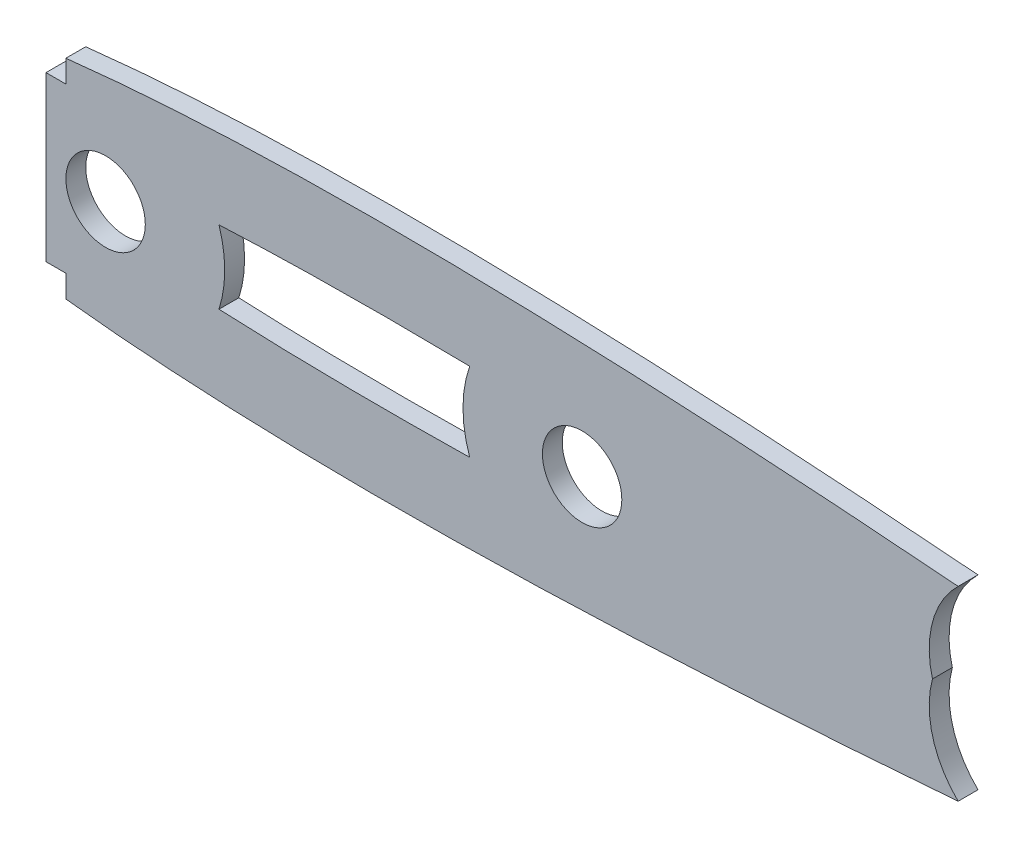
ISO-10303-21;
HEADER;
FILE_DESCRIPTION(('STEP AP214'),'2;1');
FILE_NAME('part.step','',(''),(''),'','','');
FILE_SCHEMA(('AUTOMOTIVE_DESIGN { 1 0 10303 214 1 1 1 1 }'));
ENDSEC;
DATA;
#1=APPLICATION_CONTEXT('core data for automotive mechanical design processes');
#2=APPLICATION_PROTOCOL_DEFINITION('international standard','automotive_design',2000,#1);
#3=PRODUCT_CONTEXT('',#1,'mechanical');
#4=PRODUCT('Part','Part','',(#3));
#5=PRODUCT_RELATED_PRODUCT_CATEGORY('part','',(#4));
#6=PRODUCT_DEFINITION_FORMATION('','',#4);
#7=PRODUCT_DEFINITION_CONTEXT('part definition',#1,'design');
#8=PRODUCT_DEFINITION('design','',#6,#7);
#9=PRODUCT_DEFINITION_SHAPE('','',#8);
#10=(LENGTH_UNIT() NAMED_UNIT(*) SI_UNIT(.MILLI.,.METRE.));
#11=(NAMED_UNIT(*) PLANE_ANGLE_UNIT() SI_UNIT($,.RADIAN.));
#12=(NAMED_UNIT(*) SI_UNIT($,.STERADIAN.) SOLID_ANGLE_UNIT());
#13=UNCERTAINTY_MEASURE_WITH_UNIT(LENGTH_MEASURE(1.E-05),#10,'distance_accuracy_value','');
#14=(GEOMETRIC_REPRESENTATION_CONTEXT(3) GLOBAL_UNCERTAINTY_ASSIGNED_CONTEXT((#13)) GLOBAL_UNIT_ASSIGNED_CONTEXT((#10,
#11,#12)) REPRESENTATION_CONTEXT('',''));
#15=CARTESIAN_POINT('',(0.,0.,0.));
#16=DIRECTION('',(0.,0.,1.));
#17=DIRECTION('',(1.,0.,0.));
#18=AXIS2_PLACEMENT_3D('',#15,#16,#17);
#19=CARTESIAN_POINT('',(0.0170900845920282,-0.403411610866982,3.175));
#20=DIRECTION('',(0.,0.,-1.));
#21=DIRECTION('',(-1.,0.,0.));
#22=AXIS2_PLACEMENT_3D('',#19,#20,#21);
#23=PLANE('',#22);
#24=CARTESIAN_POINT('',(50.8,0.,3.175));
#25=DIRECTION('',(0.,0.,1.));
#26=DIRECTION('',(1.,0.,0.));
#27=AXIS2_PLACEMENT_3D('',#24,#25,#26);
#28=CIRCLE('',#27,6.35);
#29=CARTESIAN_POINT('',(57.15,0.,3.175));
#30=VERTEX_POINT('',#29);
#31=EDGE_CURVE('E312',#30,#30,#28,.T.);
#32=ORIENTED_EDGE('',*,*,#31,.F.);
#33=EDGE_LOOP('',(#32));
#34=FACE_BOUND('',#33,.T.);
#35=CARTESIAN_POINT('',(127.,0.,3.175));
#36=DIRECTION('',(0.,0.,1.));
#37=DIRECTION('',(1.,0.,0.));
#38=AXIS2_PLACEMENT_3D('',#35,#36,#37);
#39=CIRCLE('',#38,6.35);
#40=CARTESIAN_POINT('',(133.35,0.,3.175));
#41=VERTEX_POINT('',#40);
#42=EDGE_CURVE('E300',#41,#41,#39,.T.);
#43=ORIENTED_EDGE('',*,*,#42,.F.);
#44=EDGE_LOOP('',(#43));
#45=FACE_BOUND('',#44,.T.);
#46=CARTESIAN_POINT('',(318.77,0.4016502,3.175));
#47=CARTESIAN_POINT('',(318.651672050798,0.50081062510207,3.175));
#48=CARTESIAN_POINT('',(317.88713952083,0.407183951533016,3.175));
#49=CARTESIAN_POINT('',(316.525702267064,0.7904298347905,3.175));
#50=CARTESIAN_POINT('',(314.029007456015,1.02731081399014,3.175));
#51=CARTESIAN_POINT('',(310.665580367581,1.53568645613262,3.175));
#52=CARTESIAN_POINT('',(306.332982445315,2.1029997142592,3.175));
#53=CARTESIAN_POINT('',(301.108142880642,2.80218722429085,3.175));
#54=CARTESIAN_POINT('',(295.004655139781,3.59255228155884,3.175));
#55=CARTESIAN_POINT('',(288.066717305627,4.47252129999186,3.175));
#56=CARTESIAN_POINT('',(280.334877507848,5.42667867616247,3.175));
#57=CARTESIAN_POINT('',(271.857503413929,6.44211126091389,3.175));
#58=CARTESIAN_POINT('',(262.68670258513,7.50622472654808,3.175));
#59=CARTESIAN_POINT('',(252.878949160097,8.60453143464443,3.175));
#60=CARTESIAN_POINT('',(242.494745531819,9.72362194936592,3.175));
#61=CARTESIAN_POINT('',(231.598187206488,10.8495970231666,3.175));
#62=CARTESIAN_POINT('',(220.256428580463,11.9679230852741,3.175));
#63=CARTESIAN_POINT('',(208.539426289446,13.0629021970691,3.175));
#64=CARTESIAN_POINT('',(196.519338709918,14.1201595424354,3.175));
#65=CARTESIAN_POINT('',(184.270405083069,15.1220196708537,3.175));
#66=CARTESIAN_POINT('',(171.867889748649,16.0521472129467,3.175));
#67=CARTESIAN_POINT('',(159.388371015463,16.8932736087619,3.175));
#68=CARTESIAN_POINT('',(146.908740176365,17.6278116310836,3.175));
#69=CARTESIAN_POINT('',(134.505824676557,18.23720410278,3.175));
#70=CARTESIAN_POINT('',(122.256224526093,18.705201006698,3.175));
#71=CARTESIAN_POINT('',(110.23510919994,19.0165345268771,3.175));
#72=CARTESIAN_POINT('',(98.5167667377854,19.1559979551147,3.175));
#73=CARTESIAN_POINT('',(87.1732015056204,19.1125234147679,3.175));
#74=CARTESIAN_POINT('',(76.2743495407503,18.8777134468916,3.175));
#75=CARTESIAN_POINT('',(65.8872982521429,18.4456158754961,3.175));
#76=CARTESIAN_POINT('',(56.0759819312477,17.8151004006929,3.175));
#77=CARTESIAN_POINT('',(46.9007012854392,16.9880642018893,3.175));
#78=CARTESIAN_POINT('',(38.4176025007467,15.9709664672286,3.175));
#79=CARTESIAN_POINT('',(30.6783927826995,14.7724611931374,3.175));
#80=CARTESIAN_POINT('',(23.7299698701266,13.4050657428601,3.175));
#81=CARTESIAN_POINT('',(17.6130594258367,11.8842416218078,3.175));
#82=CARTESIAN_POINT('',(12.3624203887116,10.2248187616682,3.175));
#83=CARTESIAN_POINT('',(8.00472945000562,8.44225238170004,3.175));
#84=CARTESIAN_POINT('',(4.55388340735938,6.54860238146803,3.175));
#85=CARTESIAN_POINT('',(2.01519229032135,4.54013127991722,3.175));
#86=CARTESIAN_POINT('',(0.389181284538515,2.36824959719999,3.175));
#87=CARTESIAN_POINT('',(-0.181372315669338,0.,3.175));
#88=CARTESIAN_POINT('',(0.389181284538492,-2.36824959719995,3.175));
#89=CARTESIAN_POINT('',(2.01519229032142,-4.5401312799173,3.175));
#90=CARTESIAN_POINT('',(4.55388340735933,-6.54860238146799,3.175));
#91=CARTESIAN_POINT('',(8.00472945000561,-8.44225238170004,3.175));
#92=CARTESIAN_POINT('',(12.3624203887116,-10.2248187616682,3.175));
#93=CARTESIAN_POINT('',(17.6130594258367,-11.8842416218078,3.175));
#94=CARTESIAN_POINT('',(23.7299698701266,-13.4050657428601,3.175));
#95=CARTESIAN_POINT('',(30.6783927826996,-14.7724611931374,3.175));
#96=CARTESIAN_POINT('',(38.4176025007467,-15.9709664672285,3.175));
#97=CARTESIAN_POINT('',(46.9007012854392,-16.9880642018893,3.175));
#98=CARTESIAN_POINT('',(56.0759819312477,-17.8151004006929,3.175));
#99=CARTESIAN_POINT('',(65.8872982521429,-18.4456158754961,3.175));
#100=CARTESIAN_POINT('',(76.2743495407503,-18.8777134468916,3.175));
#101=CARTESIAN_POINT('',(87.1732015056205,-19.1125234147679,3.175));
#102=CARTESIAN_POINT('',(98.5167667377854,-19.1559979551147,3.175));
#103=CARTESIAN_POINT('',(110.23510919994,-19.0165345268771,3.175));
#104=CARTESIAN_POINT('',(122.256224526093,-18.705201006698,3.175));
#105=CARTESIAN_POINT('',(134.505824676556,-18.23720410278,3.175));
#106=CARTESIAN_POINT('',(146.908740176365,-17.6278116310836,3.175));
#107=CARTESIAN_POINT('',(159.388371015463,-16.8932736087619,3.175));
#108=CARTESIAN_POINT('',(171.867889748649,-16.0521472129467,3.175));
#109=CARTESIAN_POINT('',(184.270405083069,-15.1220196708537,3.175));
#110=CARTESIAN_POINT('',(196.519338709918,-14.1201595424354,3.175));
#111=CARTESIAN_POINT('',(208.539426289446,-13.0629021970691,3.175));
#112=CARTESIAN_POINT('',(220.256428580463,-11.9679230852741,3.175));
#113=CARTESIAN_POINT('',(231.598187206488,-10.8495970231665,3.175));
#114=CARTESIAN_POINT('',(242.494745531819,-9.72362194936593,3.175));
#115=CARTESIAN_POINT('',(252.878949160097,-8.60453143464443,3.175));
#116=CARTESIAN_POINT('',(262.68670258513,-7.50622472654809,3.175));
#117=CARTESIAN_POINT('',(271.857503413929,-6.44211126091389,3.175));
#118=CARTESIAN_POINT('',(280.334877507848,-5.42667867616247,3.175));
#119=CARTESIAN_POINT('',(288.066717305627,-4.47252129999186,3.175));
#120=CARTESIAN_POINT('',(295.004655139781,-3.59255228155884,3.175));
#121=CARTESIAN_POINT('',(301.108142880642,-2.80218722429085,3.175));
#122=CARTESIAN_POINT('',(306.332982445315,-2.10299971425921,3.175));
#123=CARTESIAN_POINT('',(310.66558036758,-1.53568645613261,3.175));
#124=CARTESIAN_POINT('',(314.029007456015,-1.02731081399015,3.175));
#125=CARTESIAN_POINT('',(316.525702267064,-0.790429834790499,3.175));
#126=CARTESIAN_POINT('',(317.88713952083,-0.407183951532999,3.175));
#127=CARTESIAN_POINT('',(318.961628570184,-0.538768719393173,3.175));
#128=CARTESIAN_POINT('',(318.961628570184,0.241062861088163,3.175));
#129=CARTESIAN_POINT('',(318.77,0.4016502,3.175));
#130=B_SPLINE_CURVE_WITH_KNOTS('',3,(#46,#47,#48,#49,#50,#51,#52,#53,#54,#55,#56,#57,#58,#59,
#60,#61,#62,#63,#64,#65,#66,#67,#68,#69,#70,#71,#72,#73,#74,#75,#76,#77,#78,#79,#80,#81,#82,#83,
#84,#85,#86,#87,#88,#89,#90,#91,#92,#93,#94,#95,#96,#97,#98,#99,#100,#101,#102,#103,#104,#105,
#106,#107,#108,#109,#110,#111,#112,#113,#114,#115,#116,#117,#118,#119,#120,#121,#122,#123,#124,
#125,#126,#127,#128,#129),.UNSPECIFIED.,.T.,.F.,(4,1,1,1,1,1,1,1,1,1,1,1,1,1,1,1,1,1,1,1,1,1,1,
1,1,1,1,1,1,1,1,1,1,1,1,1,1,1,1,1,1,1,1,1,1,1,1,1,1,1,1,1,1,1,1,1,1,1,1,1,1,1,1,1,1,1,1,1,1,1,1,
1,1,1,1,1,1,1,1,1,1,4),(0.,0.00076221465102857,0.00304470631082172,0.00683224554312919,
0.0121011758037585,0.0188175356586858,0.026939454793122,0.0364148482585568,0.0471846285955964,
0.0591804130998147,0.0723278736139124,0.0865440610891483,0.101740580336553,0.117823336433574,
0.134691452208322,0.152240154447155,0.170361289964637,0.188941007849542,0.207865435445639,
0.227016078022501,0.246275695980001,0.265524943249896,0.284644966110444,0.303520118268662,
0.322034575374331,0.340078352914118,0.357542593241702,0.374325481920834,0.390329890871888,
0.405463889739095,0.419643801445685,0.43279337139134,0.444843816743186,0.455737920704734,
0.465428653233085,0.473886320085416,0.481101634077569,0.487101684418678,0.491975368345093,
0.495930677807379,0.499382808099288,0.502834938391198,0.506790247853484,0.511663931779899,
0.517663982121008,0.524879296113161,0.533336962965492,0.543027695493843,0.553921799455391,
0.565972244807237,0.579121814752892,0.593301726459482,0.608435725326689,0.624440134277742,
0.641223022956875,0.658687263284459,0.676731040824246,0.695245497929915,0.714120650088133,
0.733240672948681,0.752489920218576,0.771749538176075,0.790900180752937,0.809824608349034,
0.82840432623394,0.846525461751422,0.864074163990254,0.880942279765002,0.897025035862024,
0.912221555109428,0.926437742584664,0.939585203098762,0.95158098760298,0.96235076794002,
0.971826161405454,0.97994808053989,0.986664440394818,0.991933370655447,0.995720909887755,
0.998003401547548,0.998765616198576,1.),.UNSPECIFIED.);
#131=CARTESIAN_POINT('',(44.4468769341881,-16.6766275435191,3.175));
#132=VERTEX_POINT('',#131);
#133=CARTESIAN_POINT('',(187.131379050379,-14.8815283728172,3.175));
#134=VERTEX_POINT('',#133);
#135=EDGE_CURVE('E53',#132,#134,#130,.T.);
#136=ORIENTED_EDGE('',*,*,#135,.T.);
#137=CARTESIAN_POINT('',(197.744431020284,-3.94440224736243,3.175));
#138=DIRECTION('',(0.,0.,1.));
#139=DIRECTION('',(1.,0.,0.));
#140=AXIS2_PLACEMENT_3D('',#137,#138,#139);
#141=CIRCLE('',#140,15.24);
#142=CARTESIAN_POINT('',(183.023721427638,0.,3.175));
#143=VERTEX_POINT('',#142);
#144=EDGE_CURVE('E394',#143,#134,#141,.T.);
#145=ORIENTED_EDGE('',*,*,#144,.F.);
#146=CARTESIAN_POINT('',(197.744431020284,3.94440224736244,3.175));
#147=DIRECTION('',(0.,0.,1.));
#148=DIRECTION('',(1.,0.,0.));
#149=AXIS2_PLACEMENT_3D('',#146,#147,#148);
#150=CIRCLE('',#149,15.24);
#151=CARTESIAN_POINT('',(187.131379050379,14.8815283728172,3.175));
#152=VERTEX_POINT('',#151);
#153=EDGE_CURVE('E391',#152,#143,#150,.T.);
#154=ORIENTED_EDGE('',*,*,#153,.F.);
#155=CARTESIAN_POINT('',(44.4468769341882,16.6766275435191,3.175));
#156=VERTEX_POINT('',#155);
#157=EDGE_CURVE('E289',#152,#156,#130,.T.);
#158=ORIENTED_EDGE('',*,*,#157,.T.);
#159=DIRECTION('',(0.,1.,0.));
#160=VECTOR('',#159,1.);
#161=CARTESIAN_POINT('',(44.4468769341882,16.6766275435191,3.175));
#162=LINE('',#161,#160);
#163=CARTESIAN_POINT('',(44.4468769341882,13.0978024018442,3.175));
#164=VERTEX_POINT('',#163);
#165=EDGE_CURVE('E339',#164,#156,#162,.T.);
#166=ORIENTED_EDGE('',*,*,#165,.F.);
#167=DIRECTION('',(1.,0.,0.));
#168=VECTOR('',#167,1.);
#169=CARTESIAN_POINT('',(41.2718769341882,13.0978024018442,3.175));
#170=LINE('',#169,#168);
#171=CARTESIAN_POINT('',(41.2718769341882,13.0978024018442,3.175));
#172=VERTEX_POINT('',#171);
#173=EDGE_CURVE('E344',#172,#164,#170,.T.);
#174=ORIENTED_EDGE('',*,*,#173,.F.);
#175=DIRECTION('',(0.,1.,0.));
#176=VECTOR('',#175,1.);
#177=CARTESIAN_POINT('',(41.2718769341882,13.0978024018442,3.175));
#178=LINE('',#177,#176);
#179=CARTESIAN_POINT('',(41.2718769341882,-13.0978024018442,3.175));
#180=VERTEX_POINT('',#179);
#181=EDGE_CURVE('E348',#180,#172,#178,.T.);
#182=ORIENTED_EDGE('',*,*,#181,.F.);
#183=DIRECTION('',(-1.,0.,0.));
#184=VECTOR('',#183,1.);
#185=CARTESIAN_POINT('',(41.2718769341882,-13.0978024018442,3.175));
#186=LINE('',#185,#184);
#187=CARTESIAN_POINT('',(44.4468769341881,-13.0978024018442,3.175));
#188=VERTEX_POINT('',#187);
#189=EDGE_CURVE('E352',#188,#180,#186,.T.);
#190=ORIENTED_EDGE('',*,*,#189,.F.);
#191=DIRECTION('',(0.,1.,0.));
#192=VECTOR('',#191,1.);
#193=CARTESIAN_POINT('',(44.4468769341881,-13.0978024018442,3.175));
#194=LINE('',#193,#192);
#195=EDGE_CURVE('E356',#132,#188,#194,.T.);
#196=ORIENTED_EDGE('',*,*,#195,.F.);
#197=EDGE_LOOP('',(#136,#145,#154,#158,#166,#174,#182,#190,#196));
#198=FACE_BOUND('',#197,.T.);
#199=CARTESIAN_POINT('',(50.8,0.,3.175));
#200=DIRECTION('',(0.,0.,-1.));
#201=DIRECTION('',(1.,0.,0.));
#202=AXIS2_PLACEMENT_3D('',#199,#200,#201);
#203=CIRCLE('',#202,19.05);
#204=CARTESIAN_POINT('',(68.9313822041634,5.84426893345514,3.175));
#205=VERTEX_POINT('',#204);
#206=CARTESIAN_POINT('',(68.9313822041634,-5.84426893345512,3.175));
#207=VERTEX_POINT('',#206);
#208=EDGE_CURVE('E201',#205,#207,#203,.T.);
#209=ORIENTED_EDGE('',*,*,#208,.F.);
#210=CARTESIAN_POINT('',(109.024999433795,6.30887110696607,3.175));
#211=CARTESIAN_POINT('',(108.558469644795,6.31714861166145,3.175));
#212=CARTESIAN_POINT('',(108.091996748882,6.32503468756925,3.175));
#213=CARTESIAN_POINT('',(102.418728939465,6.41612991672182,3.175));
#214=CARTESIAN_POINT('',(97.2187146448106,6.44976027812399,3.175));
#215=CARTESIAN_POINT('',(86.8410911890206,6.39516748695382,3.175));
#216=CARTESIAN_POINT('',(81.6632984825462,6.30714769250087,3.175));
#217=CARTESIAN_POINT('',(73.9743318119232,6.06247541528278,3.175));
#218=CARTESIAN_POINT('',(71.4498997072654,5.96378970195194,3.175));
#219=CARTESIAN_POINT('',(68.9313822041634,5.84426893345513,3.175));
#220=B_SPLINE_CURVE_WITH_KNOTS('',3,(#210,#211,#212,#213,#214,#215,#216,#217,#218,#219),
.UNSPECIFIED.,.F.,.F.,(4,2,2,2,4),(0.488802875488267,0.5,0.625,0.75,0.811254784558479),.UNSPECIFIED.);
#221=CARTESIAN_POINT('',(109.024999433795,6.30887110696607,3.175));
#222=VERTEX_POINT('',#221);
#223=EDGE_CURVE('E61',#222,#205,#220,.T.);
#224=ORIENTED_EDGE('',*,*,#223,.F.);
#225=CARTESIAN_POINT('',(127.000000000224,5.89378404812814E-10,3.175));
#226=DIRECTION('',(0.,0.,-1.));
#227=DIRECTION('',(1.,0.,0.));
#228=AXIS2_PLACEMENT_3D('',#225,#226,#227);
#229=CIRCLE('',#228,19.05);
#230=CARTESIAN_POINT('',(109.024999434215,-6.30887110698605,3.175));
#231=VERTEX_POINT('',#230);
#232=EDGE_CURVE('E164',#231,#222,#229,.T.);
#233=ORIENTED_EDGE('',*,*,#232,.F.);
#234=CARTESIAN_POINT('',(68.9313822041634,-5.84426893345512,3.175));
#235=CARTESIAN_POINT('',(71.4498997074031,-5.96378970196082,3.175));
#236=CARTESIAN_POINT('',(73.9743318121993,-6.06247541529812,3.175));
#237=CARTESIAN_POINT('',(81.6632984829615,-6.30714769252073,3.175));
#238=CARTESIAN_POINT('',(86.8410911894363,-6.39516748697372,3.175));
#239=CARTESIAN_POINT('',(97.2187146452269,-6.44976027814397,3.175));
#240=CARTESIAN_POINT('',(102.418728939882,-6.41612991674183,3.175));
#241=CARTESIAN_POINT('',(108.0919967493,-6.32503468758927,3.175));
#242=CARTESIAN_POINT('',(108.558469645214,-6.31714861168146,3.175));
#243=CARTESIAN_POINT('',(109.024999434215,-6.30887110698605,3.175));
#244=B_SPLINE_CURVE_WITH_KNOTS('',3,(#234,#235,#236,#237,#238,#239,#240,#241,#242,#243),
.UNSPECIFIED.,.F.,.F.,(4,2,2,2,4),(0.188745215438161,0.25,0.375,0.5,0.511197124511762),.UNSPECIFIED.);
#245=EDGE_CURVE('E204',#207,#231,#244,.T.);
#246=ORIENTED_EDGE('',*,*,#245,.F.);
#247=EDGE_LOOP('',(#209,#224,#233,#246));
#248=FACE_BOUND('',#247,.T.);
#249=ADVANCED_FACE('F40',(#34,#45,#198,#248),#23,.F.);
#250=CARTESIAN_POINT('',(0.0170900845920282,-0.403411610866982,0.));
#251=DIRECTION('',(0.,0.,-1.));
#252=DIRECTION('',(-1.,0.,0.));
#253=AXIS2_PLACEMENT_3D('',#250,#251,#252);
#254=PLANE('',#253);
#255=CARTESIAN_POINT('',(127.,0.,0.));
#256=DIRECTION('',(0.,0.,1.));
#257=DIRECTION('',(1.,0.,0.));
#258=AXIS2_PLACEMENT_3D('',#255,#256,#257);
#259=CIRCLE('',#258,6.35);
#260=CARTESIAN_POINT('',(133.35,0.,0.));
#261=VERTEX_POINT('',#260);
#262=EDGE_CURVE('E307',#261,#261,#259,.T.);
#263=ORIENTED_EDGE('',*,*,#262,.T.);
#264=EDGE_LOOP('',(#263));
#265=FACE_BOUND('',#264,.T.);
#266=CARTESIAN_POINT('',(50.8,0.,0.));
#267=DIRECTION('',(0.,0.,1.));
#268=DIRECTION('',(1.,0.,0.));
#269=AXIS2_PLACEMENT_3D('',#266,#267,#268);
#270=CIRCLE('',#269,6.35);
#271=CARTESIAN_POINT('',(57.15,0.,0.));
#272=VERTEX_POINT('',#271);
#273=EDGE_CURVE('E316',#272,#272,#270,.T.);
#274=ORIENTED_EDGE('',*,*,#273,.T.);
#275=EDGE_LOOP('',(#274));
#276=FACE_BOUND('',#275,.T.);
#277=CARTESIAN_POINT('',(197.744431020284,-3.94440224736243,0.));
#278=DIRECTION('',(0.,0.,1.));
#279=DIRECTION('',(1.,0.,0.));
#280=AXIS2_PLACEMENT_3D('',#277,#278,#279);
#281=CIRCLE('',#280,15.24);
#282=CARTESIAN_POINT('',(183.023721427638,0.,0.));
#283=VERTEX_POINT('',#282);
#284=CARTESIAN_POINT('',(187.131379050379,-14.8815283728172,0.));
#285=VERTEX_POINT('',#284);
#286=EDGE_CURVE('E390',#283,#285,#281,.T.);
#287=ORIENTED_EDGE('',*,*,#286,.T.);
#288=CARTESIAN_POINT('',(318.77,0.4016502,0.));
#289=CARTESIAN_POINT('',(318.651672050798,0.50081062510207,0.));
#290=CARTESIAN_POINT('',(317.88713952083,0.407183951533016,0.));
#291=CARTESIAN_POINT('',(316.525702267064,0.7904298347905,0.));
#292=CARTESIAN_POINT('',(314.029007456015,1.02731081399014,0.));
#293=CARTESIAN_POINT('',(310.665580367581,1.53568645613262,0.));
#294=CARTESIAN_POINT('',(306.332982445315,2.1029997142592,0.));
#295=CARTESIAN_POINT('',(301.108142880642,2.80218722429085,0.));
#296=CARTESIAN_POINT('',(295.004655139781,3.59255228155884,0.));
#297=CARTESIAN_POINT('',(288.066717305627,4.47252129999186,0.));
#298=CARTESIAN_POINT('',(280.334877507848,5.42667867616247,0.));
#299=CARTESIAN_POINT('',(271.857503413929,6.44211126091389,0.));
#300=CARTESIAN_POINT('',(262.68670258513,7.50622472654808,0.));
#301=CARTESIAN_POINT('',(252.878949160097,8.60453143464443,0.));
#302=CARTESIAN_POINT('',(242.494745531819,9.72362194936592,0.));
#303=CARTESIAN_POINT('',(231.598187206488,10.8495970231666,0.));
#304=CARTESIAN_POINT('',(220.256428580463,11.9679230852741,0.));
#305=CARTESIAN_POINT('',(208.539426289446,13.0629021970691,0.));
#306=CARTESIAN_POINT('',(196.519338709918,14.1201595424354,0.));
#307=CARTESIAN_POINT('',(184.270405083069,15.1220196708537,0.));
#308=CARTESIAN_POINT('',(171.867889748649,16.0521472129467,0.));
#309=CARTESIAN_POINT('',(159.388371015463,16.8932736087619,0.));
#310=CARTESIAN_POINT('',(146.908740176365,17.6278116310836,0.));
#311=CARTESIAN_POINT('',(134.505824676557,18.23720410278,0.));
#312=CARTESIAN_POINT('',(122.256224526093,18.705201006698,0.));
#313=CARTESIAN_POINT('',(110.23510919994,19.0165345268771,0.));
#314=CARTESIAN_POINT('',(98.5167667377854,19.1559979551147,0.));
#315=CARTESIAN_POINT('',(87.1732015056204,19.1125234147679,0.));
#316=CARTESIAN_POINT('',(76.2743495407503,18.8777134468916,0.));
#317=CARTESIAN_POINT('',(65.8872982521429,18.4456158754961,0.));
#318=CARTESIAN_POINT('',(56.0759819312477,17.8151004006929,0.));
#319=CARTESIAN_POINT('',(46.9007012854392,16.9880642018893,0.));
#320=CARTESIAN_POINT('',(38.4176025007467,15.9709664672286,0.));
#321=CARTESIAN_POINT('',(30.6783927826995,14.7724611931374,0.));
#322=CARTESIAN_POINT('',(23.7299698701266,13.4050657428601,0.));
#323=CARTESIAN_POINT('',(17.6130594258367,11.8842416218078,0.));
#324=CARTESIAN_POINT('',(12.3624203887116,10.2248187616682,0.));
#325=CARTESIAN_POINT('',(8.00472945000562,8.44225238170004,0.));
#326=CARTESIAN_POINT('',(4.55388340735938,6.54860238146803,0.));
#327=CARTESIAN_POINT('',(2.01519229032135,4.54013127991722,0.));
#328=CARTESIAN_POINT('',(0.389181284538515,2.36824959719999,0.));
#329=CARTESIAN_POINT('',(-0.181372315669338,0.,0.));
#330=CARTESIAN_POINT('',(0.389181284538492,-2.36824959719995,0.));
#331=CARTESIAN_POINT('',(2.01519229032142,-4.5401312799173,0.));
#332=CARTESIAN_POINT('',(4.55388340735933,-6.54860238146799,0.));
#333=CARTESIAN_POINT('',(8.00472945000561,-8.44225238170004,0.));
#334=CARTESIAN_POINT('',(12.3624203887116,-10.2248187616682,0.));
#335=CARTESIAN_POINT('',(17.6130594258367,-11.8842416218078,0.));
#336=CARTESIAN_POINT('',(23.7299698701266,-13.4050657428601,0.));
#337=CARTESIAN_POINT('',(30.6783927826996,-14.7724611931374,0.));
#338=CARTESIAN_POINT('',(38.4176025007467,-15.9709664672285,0.));
#339=CARTESIAN_POINT('',(46.9007012854392,-16.9880642018893,0.));
#340=CARTESIAN_POINT('',(56.0759819312477,-17.8151004006929,0.));
#341=CARTESIAN_POINT('',(65.8872982521429,-18.4456158754961,0.));
#342=CARTESIAN_POINT('',(76.2743495407503,-18.8777134468916,0.));
#343=CARTESIAN_POINT('',(87.1732015056205,-19.1125234147679,0.));
#344=CARTESIAN_POINT('',(98.5167667377854,-19.1559979551147,0.));
#345=CARTESIAN_POINT('',(110.23510919994,-19.0165345268771,0.));
#346=CARTESIAN_POINT('',(122.256224526093,-18.705201006698,0.));
#347=CARTESIAN_POINT('',(134.505824676556,-18.23720410278,0.));
#348=CARTESIAN_POINT('',(146.908740176365,-17.6278116310836,0.));
#349=CARTESIAN_POINT('',(159.388371015463,-16.8932736087619,0.));
#350=CARTESIAN_POINT('',(171.867889748649,-16.0521472129467,0.));
#351=CARTESIAN_POINT('',(184.270405083069,-15.1220196708537,0.));
#352=CARTESIAN_POINT('',(196.519338709918,-14.1201595424354,0.));
#353=CARTESIAN_POINT('',(208.539426289446,-13.0629021970691,0.));
#354=CARTESIAN_POINT('',(220.256428580463,-11.9679230852741,0.));
#355=CARTESIAN_POINT('',(231.598187206488,-10.8495970231665,0.));
#356=CARTESIAN_POINT('',(242.494745531819,-9.72362194936593,0.));
#357=CARTESIAN_POINT('',(252.878949160097,-8.60453143464443,0.));
#358=CARTESIAN_POINT('',(262.68670258513,-7.50622472654809,0.));
#359=CARTESIAN_POINT('',(271.857503413929,-6.44211126091389,0.));
#360=CARTESIAN_POINT('',(280.334877507848,-5.42667867616247,0.));
#361=CARTESIAN_POINT('',(288.066717305627,-4.47252129999186,0.));
#362=CARTESIAN_POINT('',(295.004655139781,-3.59255228155884,0.));
#363=CARTESIAN_POINT('',(301.108142880642,-2.80218722429085,0.));
#364=CARTESIAN_POINT('',(306.332982445315,-2.10299971425921,0.));
#365=CARTESIAN_POINT('',(310.66558036758,-1.53568645613261,0.));
#366=CARTESIAN_POINT('',(314.029007456015,-1.02731081399015,0.));
#367=CARTESIAN_POINT('',(316.525702267064,-0.790429834790499,0.));
#368=CARTESIAN_POINT('',(317.88713952083,-0.407183951532999,0.));
#369=CARTESIAN_POINT('',(318.961628570184,-0.538768719393173,0.));
#370=CARTESIAN_POINT('',(318.961628570184,0.241062861088163,0.));
#371=CARTESIAN_POINT('',(318.77,0.4016502,0.));
#372=B_SPLINE_CURVE_WITH_KNOTS('',3,(#288,#289,#290,#291,#292,#293,#294,#295,#296,#297,#298,
#299,#300,#301,#302,#303,#304,#305,#306,#307,#308,#309,#310,#311,#312,#313,#314,#315,#316,#317,
#318,#319,#320,#321,#322,#323,#324,#325,#326,#327,#328,#329,#330,#331,#332,#333,#334,#335,#336,
#337,#338,#339,#340,#341,#342,#343,#344,#345,#346,#347,#348,#349,#350,#351,#352,#353,#354,#355,
#356,#357,#358,#359,#360,#361,#362,#363,#364,#365,#366,#367,#368,#369,#370,#371),.UNSPECIFIED.,
.T.,.F.,(4,1,1,1,1,1,1,1,1,1,1,1,1,1,1,1,1,1,1,1,1,1,1,1,1,1,1,1,1,1,1,1,1,1,1,1,1,1,1,1,1,1,1,
1,1,1,1,1,1,1,1,1,1,1,1,1,1,1,1,1,1,1,1,1,1,1,1,1,1,1,1,1,1,1,1,1,1,1,1,1,1,4),(0.,
0.00076221465102857,0.00304470631082172,0.00683224554312919,0.0121011758037585,
0.0188175356586858,0.026939454793122,0.0364148482585568,0.0471846285955964,0.0591804130998147,
0.0723278736139124,0.0865440610891483,0.101740580336553,0.117823336433574,0.134691452208322,
0.152240154447155,0.170361289964637,0.188941007849542,0.207865435445639,0.227016078022501,
0.246275695980001,0.265524943249896,0.284644966110444,0.303520118268662,0.322034575374331,
0.340078352914118,0.357542593241702,0.374325481920834,0.390329890871888,0.405463889739095,
0.419643801445685,0.43279337139134,0.444843816743186,0.455737920704734,0.465428653233085,
0.473886320085416,0.481101634077569,0.487101684418678,0.491975368345093,0.495930677807379,
0.499382808099288,0.502834938391198,0.506790247853484,0.511663931779899,0.517663982121008,
0.524879296113161,0.533336962965492,0.543027695493843,0.553921799455391,0.565972244807237,
0.579121814752892,0.593301726459482,0.608435725326689,0.624440134277742,0.641223022956875,
0.658687263284459,0.676731040824246,0.695245497929915,0.714120650088133,0.733240672948681,
0.752489920218576,0.771749538176075,0.790900180752937,0.809824608349034,0.82840432623394,
0.846525461751422,0.864074163990254,0.880942279765002,0.897025035862024,0.912221555109428,
0.926437742584664,0.939585203098762,0.95158098760298,0.96235076794002,0.971826161405454,
0.97994808053989,0.986664440394818,0.991933370655447,0.995720909887755,0.998003401547548,
0.998765616198576,1.),.UNSPECIFIED.);
#373=CARTESIAN_POINT('',(44.4468769341881,-16.6766275435191,0.));
#374=VERTEX_POINT('',#373);
#375=EDGE_CURVE('E284',#374,#285,#372,.T.);
#376=ORIENTED_EDGE('',*,*,#375,.F.);
#377=DIRECTION('',(0.,1.,0.));
#378=VECTOR('',#377,1.);
#379=CARTESIAN_POINT('',(44.4468769341881,-13.0978024018442,0.));
#380=LINE('',#379,#378);
#381=CARTESIAN_POINT('',(44.4468769341881,-13.0978024018442,0.));
#382=VERTEX_POINT('',#381);
#383=EDGE_CURVE('E343',#374,#382,#380,.T.);
#384=ORIENTED_EDGE('',*,*,#383,.T.);
#385=DIRECTION('',(-1.,0.,0.));
#386=VECTOR('',#385,1.);
#387=CARTESIAN_POINT('',(41.2718769341882,-13.0978024018442,0.));
#388=LINE('',#387,#386);
#389=CARTESIAN_POINT('',(41.2718769341882,-13.0978024018442,0.));
#390=VERTEX_POINT('',#389);
#391=EDGE_CURVE('E372',#382,#390,#388,.T.);
#392=ORIENTED_EDGE('',*,*,#391,.T.);
#393=DIRECTION('',(0.,1.,0.));
#394=VECTOR('',#393,1.);
#395=CARTESIAN_POINT('',(41.2718769341882,13.0978024018442,0.));
#396=LINE('',#395,#394);
#397=CARTESIAN_POINT('',(41.2718769341882,13.0978024018442,0.));
#398=VERTEX_POINT('',#397);
#399=EDGE_CURVE('E368',#390,#398,#396,.T.);
#400=ORIENTED_EDGE('',*,*,#399,.T.);
#401=DIRECTION('',(1.,0.,0.));
#402=VECTOR('',#401,1.);
#403=CARTESIAN_POINT('',(41.2718769341882,13.0978024018442,0.));
#404=LINE('',#403,#402);
#405=CARTESIAN_POINT('',(44.4468769341882,13.0978024018442,0.));
#406=VERTEX_POINT('',#405);
#407=EDGE_CURVE('E364',#398,#406,#404,.T.);
#408=ORIENTED_EDGE('',*,*,#407,.T.);
#409=DIRECTION('',(0.,1.,0.));
#410=VECTOR('',#409,1.);
#411=CARTESIAN_POINT('',(44.4468769341882,16.6766275435191,0.));
#412=LINE('',#411,#410);
#413=CARTESIAN_POINT('',(44.4468769341882,16.6766275435191,0.));
#414=VERTEX_POINT('',#413);
#415=EDGE_CURVE('E328',#406,#414,#412,.T.);
#416=ORIENTED_EDGE('',*,*,#415,.T.);
#417=CARTESIAN_POINT('',(187.131379050379,14.8815283728172,0.));
#418=VERTEX_POINT('',#417);
#419=EDGE_CURVE('E290',#418,#414,#372,.T.);
#420=ORIENTED_EDGE('',*,*,#419,.F.);
#421=CARTESIAN_POINT('',(197.744431020284,3.94440224736244,0.));
#422=DIRECTION('',(0.,0.,-1.));
#423=DIRECTION('',(-1.,0.,0.));
#424=AXIS2_PLACEMENT_3D('',#421,#422,#423);
#425=CIRCLE('',#424,15.24);
#426=EDGE_CURVE('E11',#283,#418,#425,.T.);
#427=ORIENTED_EDGE('',*,*,#426,.F.);
#428=EDGE_LOOP('',(#287,#376,#384,#392,#400,#408,#416,#420,#427));
#429=FACE_BOUND('',#428,.T.);
#430=CARTESIAN_POINT('',(68.9313822041634,5.84426893345513,0.));
#431=CARTESIAN_POINT('',(71.4498997072654,5.96378970195194,0.));
#432=CARTESIAN_POINT('',(73.9743318119232,6.06247541528278,0.));
#433=CARTESIAN_POINT('',(81.6632984825462,6.30714769250087,0.));
#434=CARTESIAN_POINT('',(86.8410911890206,6.39516748695382,0.));
#435=CARTESIAN_POINT('',(97.2187146448106,6.44976027812399,0.));
#436=CARTESIAN_POINT('',(102.418728939465,6.41612991672182,0.));
#437=CARTESIAN_POINT('',(108.091996748882,6.32503468756925,0.));
#438=CARTESIAN_POINT('',(108.558469644795,6.31714861166145,0.));
#439=CARTESIAN_POINT('',(109.024999433795,6.30887110696607,0.));
#440=B_SPLINE_CURVE_WITH_KNOTS('',3,(#430,#431,#432,#433,#434,#435,#436,#437,#438,#439),
.UNSPECIFIED.,.F.,.F.,(4,2,2,2,4),(0.488802875488267,0.550057660046746,0.675057660046746,
0.800057660046746,0.811254784558479),.UNSPECIFIED.);
#441=CARTESIAN_POINT('',(109.024999433795,6.30887110696607,0.));
#442=VERTEX_POINT('',#441);
#443=CARTESIAN_POINT('',(68.9313822041634,5.84426893345513,0.));
#444=VERTEX_POINT('',#443);
#445=EDGE_CURVE('E144',#442,#444,#440,.F.);
#446=ORIENTED_EDGE('',*,*,#445,.T.);
#447=CARTESIAN_POINT('',(50.8,0.,0.));
#448=DIRECTION('',(0.,0.,-1.));
#449=DIRECTION('',(1.,0.,0.));
#450=AXIS2_PLACEMENT_3D('',#447,#448,#449);
#451=CIRCLE('',#450,19.05);
#452=CARTESIAN_POINT('',(68.9313822041634,-5.84426893345512,0.));
#453=VERTEX_POINT('',#452);
#454=EDGE_CURVE('E155',#444,#453,#451,.T.);
#455=ORIENTED_EDGE('',*,*,#454,.T.);
#456=CARTESIAN_POINT('',(109.024999434215,-6.30887110698605,0.));
#457=CARTESIAN_POINT('',(108.558469645214,-6.31714861168146,0.));
#458=CARTESIAN_POINT('',(108.0919967493,-6.32503468758927,0.));
#459=CARTESIAN_POINT('',(102.418728939882,-6.41612991674183,0.));
#460=CARTESIAN_POINT('',(97.2187146452269,-6.44976027814397,0.));
#461=CARTESIAN_POINT('',(86.8410911894363,-6.39516748697372,0.));
#462=CARTESIAN_POINT('',(81.6632984829615,-6.30714769252073,0.));
#463=CARTESIAN_POINT('',(73.9743318121993,-6.06247541529812,0.));
#464=CARTESIAN_POINT('',(71.4498997074031,-5.96378970196082,0.));
#465=CARTESIAN_POINT('',(68.9313822041634,-5.84426893345512,0.));
#466=B_SPLINE_CURVE_WITH_KNOTS('',3,(#456,#457,#458,#459,#460,#461,#462,#463,#464,#465),
.UNSPECIFIED.,.F.,.F.,(4,2,2,2,4),(0.188745215438161,0.199942339949923,0.324942339949923,
0.449942339949923,0.511197124511762),.UNSPECIFIED.);
#467=CARTESIAN_POINT('',(109.024999434215,-6.30887110698605,0.));
#468=VERTEX_POINT('',#467);
#469=EDGE_CURVE('E70',#453,#468,#466,.F.);
#470=ORIENTED_EDGE('',*,*,#469,.T.);
#471=CARTESIAN_POINT('',(127.000000000224,5.89378404812814E-10,0.));
#472=DIRECTION('',(0.,0.,-1.));
#473=DIRECTION('',(1.,0.,0.));
#474=AXIS2_PLACEMENT_3D('',#471,#472,#473);
#475=CIRCLE('',#474,19.05);
#476=EDGE_CURVE('E152',#468,#442,#475,.T.);
#477=ORIENTED_EDGE('',*,*,#476,.T.);
#478=EDGE_LOOP('',(#446,#455,#470,#477));
#479=FACE_BOUND('',#478,.T.);
#480=ADVANCED_FACE('F161',(#265,#276,#429,#479),#254,.T.);
#481=DIRECTION('',(0.,0.,-1.));
#482=VECTOR('',#481,1.);
#483=SURFACE_OF_LINEAR_EXTRUSION('',#130,#482);
#484=ORIENTED_EDGE('',*,*,#157,.F.);
#485=DIRECTION('',(0.,0.,-1.));
#486=VECTOR('',#485,1.);
#487=CARTESIAN_POINT('',(187.131379050379,14.8815283728172,3.175));
#488=LINE('',#487,#486);
#489=EDGE_CURVE('E382',#152,#418,#488,.T.);
#490=ORIENTED_EDGE('',*,*,#489,.T.);
#491=ORIENTED_EDGE('',*,*,#419,.T.);
#492=DIRECTION('',(0.,0.,-1.));
#493=VECTOR('',#492,1.);
#494=CARTESIAN_POINT('',(44.4468769341882,16.6766275435191,1.5875));
#495=LINE('',#494,#493);
#496=EDGE_CURVE('E308',#414,#156,#495,.F.);
#497=ORIENTED_EDGE('',*,*,#496,.T.);
#498=EDGE_LOOP('',(#484,#490,#491,#497));
#499=FACE_BOUND('',#498,.T.);
#500=ADVANCED_FACE('F42',(#499),#483,.F.);
#501=ORIENTED_EDGE('',*,*,#375,.T.);
#502=DIRECTION('',(0.,0.,-1.));
#503=VECTOR('',#502,1.);
#504=CARTESIAN_POINT('',(187.131379050379,-14.8815283728172,3.175));
#505=LINE('',#504,#503);
#506=EDGE_CURVE('E360',#285,#134,#505,.F.);
#507=ORIENTED_EDGE('',*,*,#506,.T.);
#508=ORIENTED_EDGE('',*,*,#135,.F.);
#509=DIRECTION('',(0.,0.,-1.));
#510=VECTOR('',#509,1.);
#511=CARTESIAN_POINT('',(44.4468769341881,-16.6766275435191,1.5875));
#512=LINE('',#511,#510);
#513=EDGE_CURVE('E324',#374,#132,#512,.F.);
#514=ORIENTED_EDGE('',*,*,#513,.F.);
#515=EDGE_LOOP('',(#501,#507,#508,#514));
#516=FACE_BOUND('',#515,.T.);
#517=ADVANCED_FACE('F418',(#516),#483,.F.);
#518=CARTESIAN_POINT('',(127.,0.,0.));
#519=DIRECTION('',(0.,0.,1.));
#520=DIRECTION('',(1.,0.,0.));
#521=AXIS2_PLACEMENT_3D('',#518,#519,#520);
#522=CYLINDRICAL_SURFACE('',#521,6.35);
#523=ORIENTED_EDGE('',*,*,#262,.F.);
#524=EDGE_LOOP('',(#523));
#525=FACE_BOUND('',#524,.T.);
#526=ORIENTED_EDGE('',*,*,#42,.T.);
#527=EDGE_LOOP('',(#526));
#528=FACE_BOUND('',#527,.T.);
#529=ADVANCED_FACE('F188',(#525,#528),#522,.F.);
#530=CARTESIAN_POINT('',(50.8,0.,0.));
#531=DIRECTION('',(0.,0.,1.));
#532=DIRECTION('',(1.,0.,0.));
#533=AXIS2_PLACEMENT_3D('',#530,#531,#532);
#534=CYLINDRICAL_SURFACE('',#533,6.35);
#535=ORIENTED_EDGE('',*,*,#273,.F.);
#536=EDGE_LOOP('',(#535));
#537=FACE_BOUND('',#536,.T.);
#538=ORIENTED_EDGE('',*,*,#31,.T.);
#539=EDGE_LOOP('',(#538));
#540=FACE_BOUND('',#539,.T.);
#541=ADVANCED_FACE('F454',(#537,#540),#534,.F.);
#542=CARTESIAN_POINT('',(44.4468769341882,16.6766275435191,0.));
#543=DIRECTION('',(1.,0.,0.));
#544=DIRECTION('',(0.,1.,0.));
#545=AXIS2_PLACEMENT_3D('',#542,#543,#544);
#546=PLANE('',#545);
#547=ORIENTED_EDGE('',*,*,#165,.T.);
#548=ORIENTED_EDGE('',*,*,#496,.F.);
#549=ORIENTED_EDGE('',*,*,#415,.F.);
#550=DIRECTION('',(0.,0.,1.));
#551=VECTOR('',#550,1.);
#552=CARTESIAN_POINT('',(44.4468769341882,13.0978024018442,0.));
#553=LINE('',#552,#551);
#554=EDGE_CURVE('E323',#406,#164,#553,.T.);
#555=ORIENTED_EDGE('',*,*,#554,.T.);
#556=EDGE_LOOP('',(#547,#548,#549,#555));
#557=FACE_BOUND('',#556,.T.);
#558=ADVANCED_FACE('F441',(#557),#546,.F.);
#559=CARTESIAN_POINT('',(41.2718769341882,13.0978024018442,0.));
#560=DIRECTION('',(0.,-1.,0.));
#561=DIRECTION('',(0.,0.,-1.));
#562=AXIS2_PLACEMENT_3D('',#559,#560,#561);
#563=PLANE('',#562);
#564=ORIENTED_EDGE('',*,*,#173,.T.);
#565=ORIENTED_EDGE('',*,*,#554,.F.);
#566=ORIENTED_EDGE('',*,*,#407,.F.);
#567=DIRECTION('',(0.,0.,1.));
#568=VECTOR('',#567,1.);
#569=CARTESIAN_POINT('',(41.2718769341882,13.0978024018442,0.));
#570=LINE('',#569,#568);
#571=EDGE_CURVE('E334',#398,#172,#570,.T.);
#572=ORIENTED_EDGE('',*,*,#571,.T.);
#573=EDGE_LOOP('',(#564,#565,#566,#572));
#574=FACE_BOUND('',#573,.T.);
#575=ADVANCED_FACE('F436',(#574),#563,.F.);
#576=CARTESIAN_POINT('',(41.2718769341882,13.0978024018442,0.));
#577=DIRECTION('',(1.,0.,0.));
#578=DIRECTION('',(0.,1.,0.));
#579=AXIS2_PLACEMENT_3D('',#576,#577,#578);
#580=PLANE('',#579);
#581=ORIENTED_EDGE('',*,*,#181,.T.);
#582=ORIENTED_EDGE('',*,*,#571,.F.);
#583=ORIENTED_EDGE('',*,*,#399,.F.);
#584=DIRECTION('',(0.,0.,1.));
#585=VECTOR('',#584,1.);
#586=CARTESIAN_POINT('',(41.2718769341882,-13.0978024018442,0.));
#587=LINE('',#586,#585);
#588=EDGE_CURVE('E331',#390,#180,#587,.T.);
#589=ORIENTED_EDGE('',*,*,#588,.T.);
#590=EDGE_LOOP('',(#581,#582,#583,#589));
#591=FACE_BOUND('',#590,.T.);
#592=ADVANCED_FACE('F434',(#591),#580,.F.);
#593=CARTESIAN_POINT('',(41.2718769341882,-13.0978024018442,0.));
#594=DIRECTION('',(0.,1.,0.));
#595=DIRECTION('',(-1.,0.,0.));
#596=AXIS2_PLACEMENT_3D('',#593,#594,#595);
#597=PLANE('',#596);
#598=ORIENTED_EDGE('',*,*,#189,.T.);
#599=ORIENTED_EDGE('',*,*,#588,.F.);
#600=ORIENTED_EDGE('',*,*,#391,.F.);
#601=DIRECTION('',(0.,0.,1.));
#602=VECTOR('',#601,1.);
#603=CARTESIAN_POINT('',(44.4468769341881,-13.0978024018442,0.));
#604=LINE('',#603,#602);
#605=EDGE_CURVE('E327',#382,#188,#604,.T.);
#606=ORIENTED_EDGE('',*,*,#605,.T.);
#607=EDGE_LOOP('',(#598,#599,#600,#606));
#608=FACE_BOUND('',#607,.T.);
#609=ADVANCED_FACE('F430',(#608),#597,.F.);
#610=CARTESIAN_POINT('',(44.4468769341881,-13.0978024018442,0.));
#611=DIRECTION('',(1.,0.,0.));
#612=DIRECTION('',(0.,1.,0.));
#613=AXIS2_PLACEMENT_3D('',#610,#611,#612);
#614=PLANE('',#613);
#615=ORIENTED_EDGE('',*,*,#195,.T.);
#616=ORIENTED_EDGE('',*,*,#605,.F.);
#617=ORIENTED_EDGE('',*,*,#383,.F.);
#618=ORIENTED_EDGE('',*,*,#513,.T.);
#619=EDGE_LOOP('',(#615,#616,#617,#618));
#620=FACE_BOUND('',#619,.T.);
#621=ADVANCED_FACE('F422',(#620),#614,.F.);
#622=CARTESIAN_POINT('',(197.744431020284,-3.94440224736243,0.));
#623=DIRECTION('',(0.,0.,1.));
#624=DIRECTION('',(1.,0.,0.));
#625=AXIS2_PLACEMENT_3D('',#622,#623,#624);
#626=CYLINDRICAL_SURFACE('',#625,15.24);
#627=ORIENTED_EDGE('',*,*,#286,.F.);
#628=DIRECTION('',(0.,0.,1.));
#629=VECTOR('',#628,1.);
#630=CARTESIAN_POINT('',(183.023721427638,0.,0.));
#631=LINE('',#630,#629);
#632=EDGE_CURVE('E386',#283,#143,#631,.T.);
#633=ORIENTED_EDGE('',*,*,#632,.T.);
#634=ORIENTED_EDGE('',*,*,#144,.T.);
#635=ORIENTED_EDGE('',*,*,#506,.F.);
#636=EDGE_LOOP('',(#627,#633,#634,#635));
#637=FACE_BOUND('',#636,.T.);
#638=ADVANCED_FACE('F475',(#637),#626,.F.);
#639=CARTESIAN_POINT('',(197.744431020284,3.94440224736244,0.));
#640=DIRECTION('',(0.,0.,1.));
#641=DIRECTION('',(1.,0.,0.));
#642=AXIS2_PLACEMENT_3D('',#639,#640,#641);
#643=CYLINDRICAL_SURFACE('',#642,15.24);
#644=ORIENTED_EDGE('',*,*,#153,.T.);
#645=ORIENTED_EDGE('',*,*,#632,.F.);
#646=ORIENTED_EDGE('',*,*,#426,.T.);
#647=ORIENTED_EDGE('',*,*,#489,.F.);
#648=EDGE_LOOP('',(#644,#645,#646,#647));
#649=FACE_BOUND('',#648,.T.);
#650=ADVANCED_FACE('F237',(#649),#643,.F.);
#651=CARTESIAN_POINT('',(109.024999433795,6.30887110696607,0.));
#652=CARTESIAN_POINT('',(108.558469644795,6.31714861166145,0.));
#653=CARTESIAN_POINT('',(108.091996748882,6.32503468756925,0.));
#654=CARTESIAN_POINT('',(102.418728939465,6.41612991672182,0.));
#655=CARTESIAN_POINT('',(97.2187146448106,6.44976027812399,0.));
#656=CARTESIAN_POINT('',(86.8410911890206,6.39516748695382,0.));
#657=CARTESIAN_POINT('',(81.6632984825462,6.30714769250087,0.));
#658=CARTESIAN_POINT('',(73.9743318119232,6.06247541528278,0.));
#659=CARTESIAN_POINT('',(71.4498997072654,5.96378970195194,0.));
#660=CARTESIAN_POINT('',(68.9313822041634,5.84426893345513,0.));
#661=B_SPLINE_CURVE_WITH_KNOTS('',3,(#651,#652,#653,#654,#655,#656,#657,#658,#659,#660),
.UNSPECIFIED.,.F.,.F.,(4,2,2,2,4),(0.488802875488267,0.5,0.625,0.75,0.811254784558479),.UNSPECIFIED.);
#662=DIRECTION('',(0.,0.,1.));
#663=VECTOR('',#662,1.);
#664=SURFACE_OF_LINEAR_EXTRUSION('',#661,#663);
#665=ORIENTED_EDGE('',*,*,#223,.T.);
#666=DIRECTION('',(0.,0.,1.));
#667=VECTOR('',#666,1.);
#668=CARTESIAN_POINT('',(68.9313822041634,5.84426893345513,0.));
#669=LINE('',#668,#667);
#670=EDGE_CURVE('E140',#444,#205,#669,.T.);
#671=ORIENTED_EDGE('',*,*,#670,.F.);
#672=ORIENTED_EDGE('',*,*,#445,.F.);
#673=DIRECTION('',(0.,0.,1.));
#674=VECTOR('',#673,1.);
#675=CARTESIAN_POINT('',(109.024999433795,6.30887110696607,0.));
#676=LINE('',#675,#674);
#677=EDGE_CURVE('E224',#442,#222,#676,.T.);
#678=ORIENTED_EDGE('',*,*,#677,.T.);
#679=EDGE_LOOP('',(#665,#671,#672,#678));
#680=FACE_BOUND('',#679,.T.);
#681=ADVANCED_FACE('F142',(#680),#664,.F.);
#682=CARTESIAN_POINT('',(127.000000000224,5.89378404812814E-10,0.));
#683=DIRECTION('',(0.,0.,1.));
#684=DIRECTION('',(1.,0.,0.));
#685=AXIS2_PLACEMENT_3D('',#682,#683,#684);
#686=CYLINDRICAL_SURFACE('',#685,19.05);
#687=ORIENTED_EDGE('',*,*,#232,.T.);
#688=ORIENTED_EDGE('',*,*,#677,.F.);
#689=ORIENTED_EDGE('',*,*,#476,.F.);
#690=DIRECTION('',(0.,0.,1.));
#691=VECTOR('',#690,1.);
#692=CARTESIAN_POINT('',(109.024999434215,-6.30887110698605,0.));
#693=LINE('',#692,#691);
#694=EDGE_CURVE('E269',#468,#231,#693,.T.);
#695=ORIENTED_EDGE('',*,*,#694,.T.);
#696=EDGE_LOOP('',(#687,#688,#689,#695));
#697=FACE_BOUND('',#696,.T.);
#698=ADVANCED_FACE('F236',(#697),#686,.T.);
#699=CARTESIAN_POINT('',(68.9313822041634,-5.84426893345512,0.));
#700=CARTESIAN_POINT('',(71.4498997074031,-5.96378970196082,0.));
#701=CARTESIAN_POINT('',(73.9743318121993,-6.06247541529812,0.));
#702=CARTESIAN_POINT('',(81.6632984829615,-6.30714769252073,0.));
#703=CARTESIAN_POINT('',(86.8410911894363,-6.39516748697372,0.));
#704=CARTESIAN_POINT('',(97.2187146452269,-6.44976027814397,0.));
#705=CARTESIAN_POINT('',(102.418728939882,-6.41612991674183,0.));
#706=CARTESIAN_POINT('',(108.0919967493,-6.32503468758927,0.));
#707=CARTESIAN_POINT('',(108.558469645214,-6.31714861168146,0.));
#708=CARTESIAN_POINT('',(109.024999434215,-6.30887110698605,0.));
#709=B_SPLINE_CURVE_WITH_KNOTS('',3,(#699,#700,#701,#702,#703,#704,#705,#706,#707,#708),
.UNSPECIFIED.,.F.,.F.,(4,2,2,2,4),(0.188745215438161,0.25,0.375,0.5,0.511197124511762),.UNSPECIFIED.);
#710=DIRECTION('',(0.,0.,1.));
#711=VECTOR('',#710,1.);
#712=SURFACE_OF_LINEAR_EXTRUSION('',#709,#711);
#713=ORIENTED_EDGE('',*,*,#245,.T.);
#714=ORIENTED_EDGE('',*,*,#694,.F.);
#715=ORIENTED_EDGE('',*,*,#469,.F.);
#716=DIRECTION('',(0.,0.,1.));
#717=VECTOR('',#716,1.);
#718=CARTESIAN_POINT('',(68.9313822041634,-5.84426893345512,0.));
#719=LINE('',#718,#717);
#720=EDGE_CURVE('E151',#453,#207,#719,.T.);
#721=ORIENTED_EDGE('',*,*,#720,.T.);
#722=EDGE_LOOP('',(#713,#714,#715,#721));
#723=FACE_BOUND('',#722,.T.);
#724=ADVANCED_FACE('F254',(#723),#712,.F.);
#725=CARTESIAN_POINT('',(50.8,0.,0.));
#726=DIRECTION('',(0.,0.,1.));
#727=DIRECTION('',(1.,0.,0.));
#728=AXIS2_PLACEMENT_3D('',#725,#726,#727);
#729=CYLINDRICAL_SURFACE('',#728,19.05);
#730=ORIENTED_EDGE('',*,*,#208,.T.);
#731=ORIENTED_EDGE('',*,*,#720,.F.);
#732=ORIENTED_EDGE('',*,*,#454,.F.);
#733=ORIENTED_EDGE('',*,*,#670,.T.);
#734=EDGE_LOOP('',(#730,#731,#732,#733));
#735=FACE_BOUND('',#734,.T.);
#736=ADVANCED_FACE('F156',(#735),#729,.T.);
#737=CLOSED_SHELL('',(#249,#480,#500,#517,#529,#541,#558,#575,#592,#609,#621,#638,#650,#681,
#698,#724,#736));
#738=MANIFOLD_SOLID_BREP('B2',#737);
#739=ADVANCED_BREP_SHAPE_REPRESENTATION('',(#18,#738),#14);
#740=SHAPE_DEFINITION_REPRESENTATION(#9,#739);
ENDSEC;
END-ISO-10303-21;
